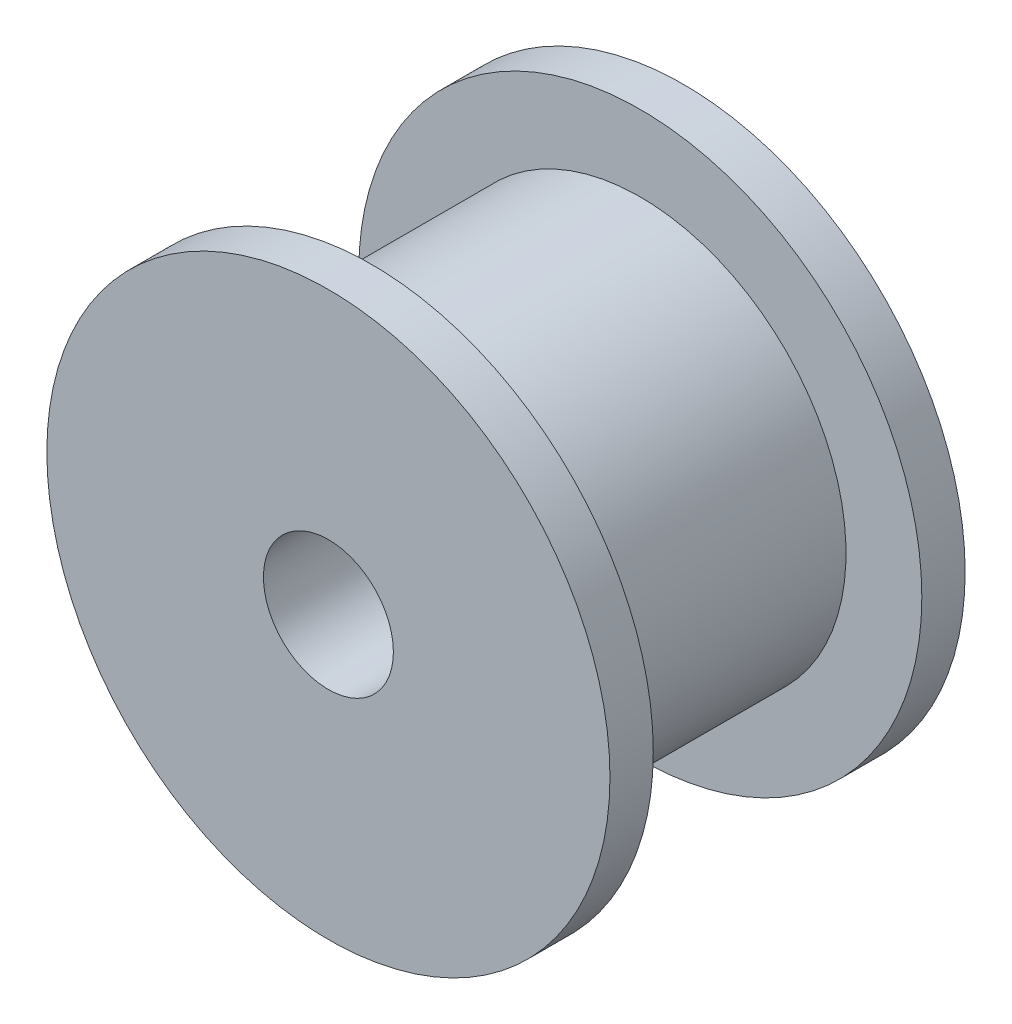
ISO-10303-21;
HEADER;
FILE_DESCRIPTION(('STEP AP214'),'2;1');
FILE_NAME('part.step','',(''),(''),'','','');
FILE_SCHEMA(('AUTOMOTIVE_DESIGN { 1 0 10303 214 1 1 1 1 }'));
ENDSEC;
DATA;
#1=APPLICATION_CONTEXT('core data for automotive mechanical design processes');
#2=APPLICATION_PROTOCOL_DEFINITION('international standard','automotive_design',2000,#1);
#3=PRODUCT_CONTEXT('',#1,'mechanical');
#4=PRODUCT('Part','Part','',(#3));
#5=PRODUCT_RELATED_PRODUCT_CATEGORY('part','',(#4));
#6=PRODUCT_DEFINITION_FORMATION('','',#4);
#7=PRODUCT_DEFINITION_CONTEXT('part definition',#1,'design');
#8=PRODUCT_DEFINITION('design','',#6,#7);
#9=PRODUCT_DEFINITION_SHAPE('','',#8);
#10=(LENGTH_UNIT() NAMED_UNIT(*) SI_UNIT(.MILLI.,.METRE.));
#11=(NAMED_UNIT(*) PLANE_ANGLE_UNIT() SI_UNIT($,.RADIAN.));
#12=(NAMED_UNIT(*) SI_UNIT($,.STERADIAN.) SOLID_ANGLE_UNIT());
#13=UNCERTAINTY_MEASURE_WITH_UNIT(LENGTH_MEASURE(1.E-05),#10,'distance_accuracy_value','');
#14=(GEOMETRIC_REPRESENTATION_CONTEXT(3) GLOBAL_UNCERTAINTY_ASSIGNED_CONTEXT((#13)) GLOBAL_UNIT_ASSIGNED_CONTEXT((#10,
#11,#12)) REPRESENTATION_CONTEXT('',''));
#15=CARTESIAN_POINT('',(0.,0.,0.));
#16=DIRECTION('',(0.,0.,1.));
#17=DIRECTION('',(1.,0.,0.));
#18=AXIS2_PLACEMENT_3D('',#15,#16,#17);
#19=CARTESIAN_POINT('',(0.,0.,1.));
#20=DIRECTION('',(0.,0.,-1.));
#21=DIRECTION('',(-1.,0.,0.));
#22=AXIS2_PLACEMENT_3D('',#19,#20,#21);
#23=CYLINDRICAL_SURFACE('',#22,6.5);
#24=CARTESIAN_POINT('',(0.,0.,1.));
#25=DIRECTION('',(0.,0.,1.));
#26=DIRECTION('',(1.,0.,0.));
#27=AXIS2_PLACEMENT_3D('',#24,#25,#26);
#28=CIRCLE('',#27,6.5);
#29=CARTESIAN_POINT('',(6.5,0.,1.));
#30=VERTEX_POINT('',#29);
#31=EDGE_CURVE('E10',#30,#30,#28,.T.);
#32=ORIENTED_EDGE('',*,*,#31,.F.);
#33=EDGE_LOOP('',(#32));
#34=FACE_BOUND('',#33,.T.);
#35=CARTESIAN_POINT('',(0.,0.,0.));
#36=DIRECTION('',(0.,0.,1.));
#37=DIRECTION('',(1.,0.,0.));
#38=AXIS2_PLACEMENT_3D('',#35,#36,#37);
#39=CIRCLE('',#38,6.5);
#40=CARTESIAN_POINT('',(6.5,0.,0.));
#41=VERTEX_POINT('',#40);
#42=EDGE_CURVE('E34',#41,#41,#39,.T.);
#43=ORIENTED_EDGE('',*,*,#42,.T.);
#44=EDGE_LOOP('',(#43));
#45=FACE_BOUND('',#44,.T.);
#46=ADVANCED_FACE('F31',(#34,#45),#23,.T.);
#47=CARTESIAN_POINT('',(0.,0.,1.));
#48=DIRECTION('',(0.,0.,1.));
#49=DIRECTION('',(1.,0.,0.));
#50=AXIS2_PLACEMENT_3D('',#47,#48,#49);
#51=PLANE('',#50);
#52=CARTESIAN_POINT('',(0.,0.,1.));
#53=DIRECTION('',(0.,0.,1.));
#54=DIRECTION('',(1.,0.,0.));
#55=AXIS2_PLACEMENT_3D('',#52,#53,#54);
#56=CIRCLE('',#55,4.75);
#57=CARTESIAN_POINT('',(-4.75,0.,1.));
#58=VERTEX_POINT('',#57);
#59=EDGE_CURVE('E43',#58,#58,#56,.T.);
#60=ORIENTED_EDGE('',*,*,#59,.F.);
#61=EDGE_LOOP('',(#60));
#62=FACE_BOUND('',#61,.T.);
#63=ORIENTED_EDGE('',*,*,#31,.T.);
#64=EDGE_LOOP('',(#63));
#65=FACE_BOUND('',#64,.T.);
#66=ADVANCED_FACE('F86',(#62,#65),#51,.T.);
#67=CARTESIAN_POINT('',(0.,0.,0.));
#68=DIRECTION('',(0.,0.,1.));
#69=DIRECTION('',(1.,0.,0.));
#70=AXIS2_PLACEMENT_3D('',#67,#68,#69);
#71=PLANE('',#70);
#72=CARTESIAN_POINT('',(0.,0.,0.));
#73=DIRECTION('',(0.,0.,1.));
#74=DIRECTION('',(1.,0.,0.));
#75=AXIS2_PLACEMENT_3D('',#72,#73,#74);
#76=CIRCLE('',#75,1.5);
#77=CARTESIAN_POINT('',(1.5,0.,0.));
#78=VERTEX_POINT('',#77);
#79=EDGE_CURVE('E52',#78,#78,#76,.T.);
#80=ORIENTED_EDGE('',*,*,#79,.T.);
#81=EDGE_LOOP('',(#80));
#82=FACE_BOUND('',#81,.T.);
#83=ORIENTED_EDGE('',*,*,#42,.F.);
#84=EDGE_LOOP('',(#83));
#85=FACE_BOUND('',#84,.T.);
#86=ADVANCED_FACE('F91',(#82,#85),#71,.F.);
#87=CARTESIAN_POINT('',(0.,0.,7.2));
#88=DIRECTION('',(0.,0.,-1.));
#89=DIRECTION('',(-1.,0.,0.));
#90=AXIS2_PLACEMENT_3D('',#87,#88,#89);
#91=CYLINDRICAL_SURFACE('',#90,4.75);
#92=CARTESIAN_POINT('',(0.,0.,7.2));
#93=DIRECTION('',(0.,0.,1.));
#94=DIRECTION('',(1.,0.,0.));
#95=AXIS2_PLACEMENT_3D('',#92,#93,#94);
#96=CIRCLE('',#95,4.75);
#97=CARTESIAN_POINT('',(-4.75,0.,7.2));
#98=VERTEX_POINT('',#97);
#99=EDGE_CURVE('E41',#98,#98,#96,.T.);
#100=CARTESIAN_POINT('',(-4.75,0.,7.2));
#101=CARTESIAN_POINT('',(-4.75,0.,7.13541666666667));
#102=CARTESIAN_POINT('',(-4.75,0.,7.07083333333333));
#103=CARTESIAN_POINT('',(-4.75,0.,6.94166666666667));
#104=CARTESIAN_POINT('',(-4.75,0.,6.87708333333333));
#105=CARTESIAN_POINT('',(-4.75,0.,6.74791666666667));
#106=CARTESIAN_POINT('',(-4.75,0.,6.68333333333333));
#107=CARTESIAN_POINT('',(-4.75,0.,6.55416666666667));
#108=CARTESIAN_POINT('',(-4.75,0.,6.48958333333333));
#109=CARTESIAN_POINT('',(-4.75,0.,6.36041666666667));
#110=CARTESIAN_POINT('',(-4.75,0.,6.29583333333333));
#111=CARTESIAN_POINT('',(-4.75,0.,6.16666666666667));
#112=CARTESIAN_POINT('',(-4.75,0.,6.10208333333333));
#113=CARTESIAN_POINT('',(-4.75,0.,5.97291666666667));
#114=CARTESIAN_POINT('',(-4.75,0.,5.90833333333333));
#115=CARTESIAN_POINT('',(-4.75,0.,5.77916666666667));
#116=CARTESIAN_POINT('',(-4.75,0.,5.71458333333333));
#117=CARTESIAN_POINT('',(-4.75,0.,5.58541666666667));
#118=CARTESIAN_POINT('',(-4.75,0.,5.52083333333333));
#119=CARTESIAN_POINT('',(-4.75,0.,5.39166666666667));
#120=CARTESIAN_POINT('',(-4.75,0.,5.32708333333333));
#121=CARTESIAN_POINT('',(-4.75,0.,5.19791666666667));
#122=CARTESIAN_POINT('',(-4.75,0.,5.13333333333333));
#123=CARTESIAN_POINT('',(-4.75,0.,5.00416666666667));
#124=CARTESIAN_POINT('',(-4.75,0.,4.93958333333333));
#125=CARTESIAN_POINT('',(-4.75,0.,4.81041666666667));
#126=CARTESIAN_POINT('',(-4.75,0.,4.74583333333333));
#127=CARTESIAN_POINT('',(-4.75,0.,4.61666666666667));
#128=CARTESIAN_POINT('',(-4.75,0.,4.55208333333333));
#129=CARTESIAN_POINT('',(-4.75,0.,4.42291666666667));
#130=CARTESIAN_POINT('',(-4.75,0.,4.35833333333333));
#131=CARTESIAN_POINT('',(-4.75,0.,4.22916666666667));
#132=CARTESIAN_POINT('',(-4.75,0.,4.16458333333333));
#133=CARTESIAN_POINT('',(-4.75,0.,4.03541666666667));
#134=CARTESIAN_POINT('',(-4.75,0.,3.97083333333333));
#135=CARTESIAN_POINT('',(-4.75,0.,3.84166666666667));
#136=CARTESIAN_POINT('',(-4.75,0.,3.77708333333333));
#137=CARTESIAN_POINT('',(-4.75,0.,3.64791666666667));
#138=CARTESIAN_POINT('',(-4.75,0.,3.58333333333333));
#139=CARTESIAN_POINT('',(-4.75,0.,3.45416666666667));
#140=CARTESIAN_POINT('',(-4.75,0.,3.38958333333333));
#141=CARTESIAN_POINT('',(-4.75,0.,3.26041666666667));
#142=CARTESIAN_POINT('',(-4.75,0.,3.19583333333333));
#143=CARTESIAN_POINT('',(-4.75,0.,3.06666666666667));
#144=CARTESIAN_POINT('',(-4.75,0.,3.00208333333333));
#145=CARTESIAN_POINT('',(-4.75,0.,2.87291666666667));
#146=CARTESIAN_POINT('',(-4.75,0.,2.80833333333333));
#147=CARTESIAN_POINT('',(-4.75,0.,2.67916666666667));
#148=CARTESIAN_POINT('',(-4.75,0.,2.61458333333333));
#149=CARTESIAN_POINT('',(-4.75,0.,2.48541666666667));
#150=CARTESIAN_POINT('',(-4.75,0.,2.42083333333333));
#151=CARTESIAN_POINT('',(-4.75,0.,2.29166666666667));
#152=CARTESIAN_POINT('',(-4.75,0.,2.22708333333333));
#153=CARTESIAN_POINT('',(-4.75,0.,2.09791666666667));
#154=CARTESIAN_POINT('',(-4.75,0.,2.03333333333333));
#155=CARTESIAN_POINT('',(-4.75,0.,1.90416666666667));
#156=CARTESIAN_POINT('',(-4.75,0.,1.83958333333333));
#157=CARTESIAN_POINT('',(-4.75,0.,1.71041666666667));
#158=CARTESIAN_POINT('',(-4.75,0.,1.64583333333333));
#159=CARTESIAN_POINT('',(-4.75,0.,1.51666666666667));
#160=CARTESIAN_POINT('',(-4.75,0.,1.45208333333333));
#161=CARTESIAN_POINT('',(-4.75,0.,1.32291666666667));
#162=CARTESIAN_POINT('',(-4.75,0.,1.25833333333333));
#163=CARTESIAN_POINT('',(-4.75,0.,1.12916666666667));
#164=CARTESIAN_POINT('',(-4.75,0.,1.06458333333333));
#165=CARTESIAN_POINT('',(-4.75,0.,1.));
#166=B_SPLINE_CURVE_WITH_KNOTS('',3,(#100,#101,#102,#103,#104,#105,#106,#107,#108,#109,#110,
#111,#112,#113,#114,#115,#116,#117,#118,#119,#120,#121,#122,#123,#124,#125,#126,#127,#128,#129,
#130,#131,#132,#133,#134,#135,#136,#137,#138,#139,#140,#141,#142,#143,#144,#145,#146,#147,#148,
#149,#150,#151,#152,#153,#154,#155,#156,#157,#158,#159,#160,#161,#162,#163,#164,#165),
.UNSPECIFIED.,.F.,.F.,(4,2,2,2,2,2,2,2,2,2,2,2,2,2,2,2,2,2,2,2,2,2,2,2,2,2,2,2,2,2,2,2,4),(0.,
0.193749999999999,0.3875,0.581249999999999,0.775,0.968749999999999,1.1625,1.35625,1.55,1.74375,
1.9375,2.13125,2.325,2.51875,2.7125,2.90625,3.1,3.29375,3.4875,3.68125,3.875,4.06875,4.2625,
4.45625,4.65,4.84375,5.0375,5.23125,5.425,5.61875,5.8125,6.00625,6.2),.UNSPECIFIED.);
#167=EDGE_CURVE('BSEAM74',#98,#58,#166,.T.);
#168=ORIENTED_EDGE('',*,*,#99,.F.);
#169=ORIENTED_EDGE('',*,*,#59,.T.);
#170=ORIENTED_EDGE('',*,*,#167,.T.);
#171=ORIENTED_EDGE('',*,*,#167,.F.);
#172=EDGE_LOOP('',(#168,#170,#169,#171));
#173=FACE_BOUND('',#172,.T.);
#174=ADVANCED_FACE('F74',(#173),#91,.T.);
#175=CARTESIAN_POINT('',(0.,0.,8.2));
#176=DIRECTION('',(0.,0.,-1.));
#177=DIRECTION('',(-1.,0.,0.));
#178=AXIS2_PLACEMENT_3D('',#175,#176,#177);
#179=CYLINDRICAL_SURFACE('',#178,6.5);
#180=CARTESIAN_POINT('',(0.,0.,8.2));
#181=DIRECTION('',(0.,0.,1.));
#182=DIRECTION('',(1.,0.,0.));
#183=AXIS2_PLACEMENT_3D('',#180,#181,#182);
#184=CIRCLE('',#183,6.5);
#185=CARTESIAN_POINT('',(6.5,0.,8.2));
#186=VERTEX_POINT('',#185);
#187=EDGE_CURVE('E46',#186,#186,#184,.T.);
#188=ORIENTED_EDGE('',*,*,#187,.F.);
#189=EDGE_LOOP('',(#188));
#190=FACE_BOUND('',#189,.T.);
#191=CARTESIAN_POINT('',(0.,0.,7.2));
#192=DIRECTION('',(0.,0.,1.));
#193=DIRECTION('',(1.,0.,0.));
#194=AXIS2_PLACEMENT_3D('',#191,#192,#193);
#195=CIRCLE('',#194,6.5);
#196=CARTESIAN_POINT('',(6.5,0.,7.2));
#197=VERTEX_POINT('',#196);
#198=EDGE_CURVE('E49',#197,#197,#195,.T.);
#199=ORIENTED_EDGE('',*,*,#198,.T.);
#200=EDGE_LOOP('',(#199));
#201=FACE_BOUND('',#200,.T.);
#202=ADVANCED_FACE('F68',(#190,#201),#179,.T.);
#203=CARTESIAN_POINT('',(0.,0.,8.2));
#204=DIRECTION('',(0.,0.,1.));
#205=DIRECTION('',(1.,0.,0.));
#206=AXIS2_PLACEMENT_3D('',#203,#204,#205);
#207=PLANE('',#206);
#208=CARTESIAN_POINT('',(0.,0.,8.2));
#209=DIRECTION('',(0.,0.,1.));
#210=DIRECTION('',(1.,0.,0.));
#211=AXIS2_PLACEMENT_3D('',#208,#209,#210);
#212=CIRCLE('',#211,1.5);
#213=CARTESIAN_POINT('',(1.5,0.,8.2));
#214=VERTEX_POINT('',#213);
#215=EDGE_CURVE('E57',#214,#214,#212,.T.);
#216=ORIENTED_EDGE('',*,*,#215,.F.);
#217=EDGE_LOOP('',(#216));
#218=FACE_BOUND('',#217,.T.);
#219=ORIENTED_EDGE('',*,*,#187,.T.);
#220=EDGE_LOOP('',(#219));
#221=FACE_BOUND('',#220,.T.);
#222=ADVANCED_FACE('F64',(#218,#221),#207,.T.);
#223=CARTESIAN_POINT('',(0.,0.,7.2));
#224=DIRECTION('',(0.,0.,1.));
#225=DIRECTION('',(1.,0.,0.));
#226=AXIS2_PLACEMENT_3D('',#223,#224,#225);
#227=PLANE('',#226);
#228=ORIENTED_EDGE('',*,*,#99,.T.);
#229=EDGE_LOOP('',(#228));
#230=FACE_BOUND('',#229,.T.);
#231=ORIENTED_EDGE('',*,*,#198,.F.);
#232=EDGE_LOOP('',(#231));
#233=FACE_BOUND('',#232,.T.);
#234=ADVANCED_FACE('F67',(#230,#233),#227,.F.);
#235=CARTESIAN_POINT('',(0.,0.,-1.8));
#236=DIRECTION('',(0.,0.,1.));
#237=DIRECTION('',(1.,0.,0.));
#238=AXIS2_PLACEMENT_3D('',#235,#236,#237);
#239=CYLINDRICAL_SURFACE('',#238,1.5);
#240=ORIENTED_EDGE('',*,*,#215,.T.);
#241=EDGE_LOOP('',(#240));
#242=FACE_BOUND('',#241,.T.);
#243=ORIENTED_EDGE('',*,*,#79,.F.);
#244=EDGE_LOOP('',(#243));
#245=FACE_BOUND('',#244,.T.);
#246=ADVANCED_FACE('F61',(#242,#245),#239,.F.);
#247=CLOSED_SHELL('',(#46,#66,#86,#174,#202,#222,#234,#246));
#248=MANIFOLD_SOLID_BREP('B2',#247);
#249=ADVANCED_BREP_SHAPE_REPRESENTATION('',(#18,#248),#14);
#250=SHAPE_DEFINITION_REPRESENTATION(#9,#249);
ENDSEC;
END-ISO-10303-21;
